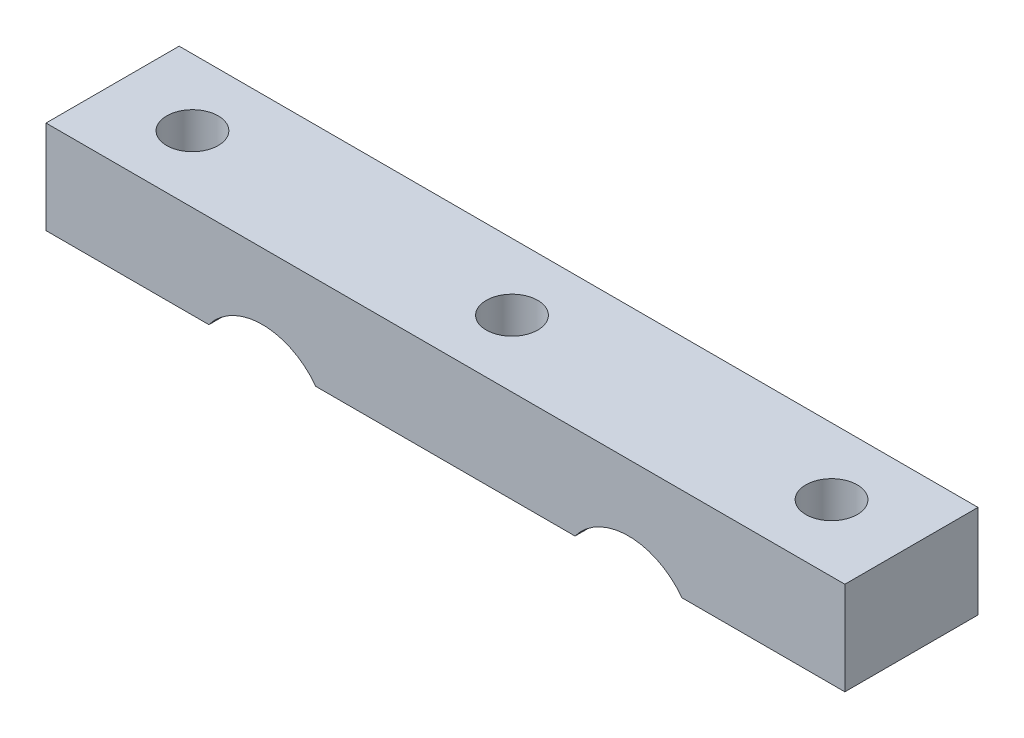
ISO-10303-21;
HEADER;
FILE_DESCRIPTION(('STEP AP214'),'2;1');
FILE_NAME('part.step','',(''),(''),'','','');
FILE_SCHEMA(('AUTOMOTIVE_DESIGN { 1 0 10303 214 1 1 1 1 }'));
ENDSEC;
DATA;
#1=APPLICATION_CONTEXT('core data for automotive mechanical design processes');
#2=APPLICATION_PROTOCOL_DEFINITION('international standard','automotive_design',2000,#1);
#3=PRODUCT_CONTEXT('',#1,'mechanical');
#4=PRODUCT('Part','Part','',(#3));
#5=PRODUCT_RELATED_PRODUCT_CATEGORY('part','',(#4));
#6=PRODUCT_DEFINITION_FORMATION('','',#4);
#7=PRODUCT_DEFINITION_CONTEXT('part definition',#1,'design');
#8=PRODUCT_DEFINITION('design','',#6,#7);
#9=PRODUCT_DEFINITION_SHAPE('','',#8);
#10=(LENGTH_UNIT() NAMED_UNIT(*) SI_UNIT(.MILLI.,.METRE.));
#11=(NAMED_UNIT(*) PLANE_ANGLE_UNIT() SI_UNIT($,.RADIAN.));
#12=(NAMED_UNIT(*) SI_UNIT($,.STERADIAN.) SOLID_ANGLE_UNIT());
#13=UNCERTAINTY_MEASURE_WITH_UNIT(LENGTH_MEASURE(1.E-05),#10,'distance_accuracy_value','');
#14=(GEOMETRIC_REPRESENTATION_CONTEXT(3) GLOBAL_UNCERTAINTY_ASSIGNED_CONTEXT((#13)) GLOBAL_UNIT_ASSIGNED_CONTEXT((#10,
#11,#12)) REPRESENTATION_CONTEXT('',''));
#15=CARTESIAN_POINT('',(0.,0.,0.));
#16=DIRECTION('',(0.,0.,1.));
#17=DIRECTION('',(1.,0.,0.));
#18=AXIS2_PLACEMENT_3D('',#15,#16,#17);
#19=CARTESIAN_POINT('',(-17.4625,20.9296,12.7));
#20=DIRECTION('',(0.,0.,-1.));
#21=DIRECTION('',(-1.,0.,0.));
#22=AXIS2_PLACEMENT_3D('',#19,#20,#21);
#23=CYLINDRICAL_SURFACE('',#22,6.35);
#24=CARTESIAN_POINT('',(-17.4625,20.9296,0.));
#25=DIRECTION('',(0.,0.,-1.));
#26=DIRECTION('',(1.,0.,0.));
#27=AXIS2_PLACEMENT_3D('',#24,#25,#26);
#28=CIRCLE('',#27,6.35);
#29=CARTESIAN_POINT('',(-22.5614511509721,24.7142,0.));
#30=VERTEX_POINT('',#29);
#31=CARTESIAN_POINT('',(-12.3635488490279,24.7142,0.));
#32=VERTEX_POINT('',#31);
#33=EDGE_CURVE('E139',#30,#32,#28,.T.);
#34=ORIENTED_EDGE('',*,*,#33,.T.);
#35=DIRECTION('',(0.,0.,-1.));
#36=VECTOR('',#35,1.);
#37=CARTESIAN_POINT('',(-12.3635488490279,24.7142,12.7));
#38=LINE('',#37,#36);
#39=CARTESIAN_POINT('',(-12.3635488490279,24.7142,12.7));
#40=VERTEX_POINT('',#39);
#41=EDGE_CURVE('E11',#40,#32,#38,.T.);
#42=ORIENTED_EDGE('',*,*,#41,.F.);
#43=CARTESIAN_POINT('',(-17.4625,20.9296,12.7));
#44=DIRECTION('',(0.,0.,-1.));
#45=DIRECTION('',(1.,0.,0.));
#46=AXIS2_PLACEMENT_3D('',#43,#44,#45);
#47=CIRCLE('',#46,6.35);
#48=CARTESIAN_POINT('',(-22.5614511509721,24.7142,12.7));
#49=VERTEX_POINT('',#48);
#50=EDGE_CURVE('E154',#49,#40,#47,.T.);
#51=ORIENTED_EDGE('',*,*,#50,.F.);
#52=DIRECTION('',(0.,0.,-1.));
#53=VECTOR('',#52,1.);
#54=CARTESIAN_POINT('',(-22.5614511509721,24.7142,12.7));
#55=LINE('',#54,#53);
#56=EDGE_CURVE('E135',#49,#30,#55,.T.);
#57=ORIENTED_EDGE('',*,*,#56,.T.);
#58=EDGE_LOOP('',(#34,#42,#51,#57));
#59=FACE_BOUND('',#58,.T.);
#60=ADVANCED_FACE('F43',(#59),#23,.F.);
#61=CARTESIAN_POINT('',(-12.3635488490279,24.7142,12.7));
#62=DIRECTION('',(0.,1.,0.));
#63=DIRECTION('',(0.,0.,1.));
#64=AXIS2_PLACEMENT_3D('',#61,#62,#63);
#65=PLANE('',#64);
#66=CARTESIAN_POINT('',(0.,24.7142,6.35));
#67=DIRECTION('',(0.,1.,0.));
#68=DIRECTION('',(0.,0.,1.));
#69=AXIS2_PLACEMENT_3D('',#66,#67,#68);
#70=CIRCLE('',#69,2.45745);
#71=CARTESIAN_POINT('',(0.,24.7142,8.80745));
#72=VERTEX_POINT('',#71);
#73=EDGE_CURVE('E192',#72,#72,#70,.T.);
#74=ORIENTED_EDGE('',*,*,#73,.T.);
#75=EDGE_LOOP('',(#74));
#76=FACE_BOUND('',#75,.T.);
#77=DIRECTION('',(1.,0.,0.));
#78=VECTOR('',#77,1.);
#79=CARTESIAN_POINT('',(-12.3635488490279,24.7142,0.));
#80=LINE('',#79,#78);
#81=CARTESIAN_POINT('',(12.3635488490279,24.7142,0.));
#82=VERTEX_POINT('',#81);
#83=EDGE_CURVE('E142',#32,#82,#80,.T.);
#84=ORIENTED_EDGE('',*,*,#83,.T.);
#85=DIRECTION('',(0.,0.,-1.));
#86=VECTOR('',#85,1.);
#87=CARTESIAN_POINT('',(12.3635488490279,24.7142,12.7));
#88=LINE('',#87,#86);
#89=CARTESIAN_POINT('',(12.3635488490279,24.7142,12.7));
#90=VERTEX_POINT('',#89);
#91=EDGE_CURVE('E51',#90,#82,#88,.T.);
#92=ORIENTED_EDGE('',*,*,#91,.F.);
#93=DIRECTION('',(1.,0.,0.));
#94=VECTOR('',#93,1.);
#95=CARTESIAN_POINT('',(-12.3635488490279,24.7142,12.7));
#96=LINE('',#95,#94);
#97=EDGE_CURVE('E102',#40,#90,#96,.T.);
#98=ORIENTED_EDGE('',*,*,#97,.F.);
#99=ORIENTED_EDGE('',*,*,#41,.T.);
#100=EDGE_LOOP('',(#84,#92,#98,#99));
#101=FACE_BOUND('',#100,.T.);
#102=ADVANCED_FACE('F230',(#76,#101),#65,.F.);
#103=CARTESIAN_POINT('',(17.4625,20.9296,12.7));
#104=DIRECTION('',(0.,0.,-1.));
#105=DIRECTION('',(-1.,0.,0.));
#106=AXIS2_PLACEMENT_3D('',#103,#104,#105);
#107=CYLINDRICAL_SURFACE('',#106,6.35);
#108=CARTESIAN_POINT('',(17.4625,20.9296,0.));
#109=DIRECTION('',(0.,0.,-1.));
#110=DIRECTION('',(-1.,0.,0.));
#111=AXIS2_PLACEMENT_3D('',#108,#109,#110);
#112=CIRCLE('',#111,6.35);
#113=CARTESIAN_POINT('',(22.5614511509721,24.7142,0.));
#114=VERTEX_POINT('',#113);
#115=EDGE_CURVE('E145',#82,#114,#112,.T.);
#116=ORIENTED_EDGE('',*,*,#115,.T.);
#117=DIRECTION('',(0.,0.,-1.));
#118=VECTOR('',#117,1.);
#119=CARTESIAN_POINT('',(22.5614511509721,24.7142,12.7));
#120=LINE('',#119,#118);
#121=CARTESIAN_POINT('',(22.5614511509721,24.7142,12.7));
#122=VERTEX_POINT('',#121);
#123=EDGE_CURVE('E161',#122,#114,#120,.T.);
#124=ORIENTED_EDGE('',*,*,#123,.F.);
#125=CARTESIAN_POINT('',(17.4625,20.9296,12.7));
#126=DIRECTION('',(0.,0.,-1.));
#127=DIRECTION('',(-1.,0.,0.));
#128=AXIS2_PLACEMENT_3D('',#125,#126,#127);
#129=CIRCLE('',#128,6.35);
#130=EDGE_CURVE('E169',#90,#122,#129,.T.);
#131=ORIENTED_EDGE('',*,*,#130,.F.);
#132=ORIENTED_EDGE('',*,*,#91,.T.);
#133=EDGE_LOOP('',(#116,#124,#131,#132));
#134=FACE_BOUND('',#133,.T.);
#135=ADVANCED_FACE('F167',(#134),#107,.F.);
#136=CARTESIAN_POINT('',(22.5614511509721,24.7142,12.7));
#137=DIRECTION('',(0.,1.,0.));
#138=DIRECTION('',(0.,0.,1.));
#139=AXIS2_PLACEMENT_3D('',#136,#137,#138);
#140=PLANE('',#139);
#141=CARTESIAN_POINT('',(30.48,24.7142,6.35));
#142=DIRECTION('',(0.,1.,0.));
#143=DIRECTION('',(0.,0.,1.));
#144=AXIS2_PLACEMENT_3D('',#141,#142,#143);
#145=CIRCLE('',#144,2.45745);
#146=CARTESIAN_POINT('',(30.48,24.7142,8.80745));
#147=VERTEX_POINT('',#146);
#148=EDGE_CURVE('E143',#147,#147,#145,.T.);
#149=ORIENTED_EDGE('',*,*,#148,.T.);
#150=EDGE_LOOP('',(#149));
#151=FACE_BOUND('',#150,.T.);
#152=DIRECTION('',(1.,0.,0.));
#153=VECTOR('',#152,1.);
#154=CARTESIAN_POINT('',(22.5614511509721,24.7142,0.));
#155=LINE('',#154,#153);
#156=CARTESIAN_POINT('',(38.1,24.7142,0.));
#157=VERTEX_POINT('',#156);
#158=EDGE_CURVE('E147',#114,#157,#155,.T.);
#159=ORIENTED_EDGE('',*,*,#158,.T.);
#160=DIRECTION('',(0.,0.,-1.));
#161=VECTOR('',#160,1.);
#162=CARTESIAN_POINT('',(38.1,24.7142,12.7));
#163=LINE('',#162,#161);
#164=CARTESIAN_POINT('',(38.1,24.7142,12.7));
#165=VERTEX_POINT('',#164);
#166=EDGE_CURVE('E158',#165,#157,#163,.T.);
#167=ORIENTED_EDGE('',*,*,#166,.F.);
#168=DIRECTION('',(1.,0.,0.));
#169=VECTOR('',#168,1.);
#170=CARTESIAN_POINT('',(22.5614511509721,24.7142,12.7));
#171=LINE('',#170,#169);
#172=EDGE_CURVE('E181',#122,#165,#171,.T.);
#173=ORIENTED_EDGE('',*,*,#172,.F.);
#174=ORIENTED_EDGE('',*,*,#123,.T.);
#175=EDGE_LOOP('',(#159,#167,#173,#174));
#176=FACE_BOUND('',#175,.T.);
#177=ADVANCED_FACE('F177',(#151,#176),#140,.F.);
#178=CARTESIAN_POINT('',(38.1,33.6042,12.7));
#179=DIRECTION('',(-1.,0.,0.));
#180=DIRECTION('',(0.,0.,1.));
#181=AXIS2_PLACEMENT_3D('',#178,#179,#180);
#182=PLANE('',#181);
#183=DIRECTION('',(0.,1.,0.));
#184=VECTOR('',#183,1.);
#185=CARTESIAN_POINT('',(38.1,33.6042,0.));
#186=LINE('',#185,#184);
#187=CARTESIAN_POINT('',(38.1,33.6042,0.));
#188=VERTEX_POINT('',#187);
#189=EDGE_CURVE('E149',#157,#188,#186,.T.);
#190=ORIENTED_EDGE('',*,*,#189,.T.);
#191=DIRECTION('',(0.,0.,-1.));
#192=VECTOR('',#191,1.);
#193=CARTESIAN_POINT('',(38.1,33.6042,12.7));
#194=LINE('',#193,#192);
#195=CARTESIAN_POINT('',(38.1,33.6042,12.7));
#196=VERTEX_POINT('',#195);
#197=EDGE_CURVE('E130',#196,#188,#194,.T.);
#198=ORIENTED_EDGE('',*,*,#197,.F.);
#199=DIRECTION('',(0.,1.,0.));
#200=VECTOR('',#199,1.);
#201=CARTESIAN_POINT('',(38.1,33.6042,12.7));
#202=LINE('',#201,#200);
#203=EDGE_CURVE('E121',#165,#196,#202,.T.);
#204=ORIENTED_EDGE('',*,*,#203,.F.);
#205=ORIENTED_EDGE('',*,*,#166,.T.);
#206=EDGE_LOOP('',(#190,#198,#204,#205));
#207=FACE_BOUND('',#206,.T.);
#208=ADVANCED_FACE('F180',(#207),#182,.F.);
#209=CARTESIAN_POINT('',(-38.1,33.6042,12.7));
#210=DIRECTION('',(0.,-1.,0.));
#211=DIRECTION('',(0.,0.,-1.));
#212=AXIS2_PLACEMENT_3D('',#209,#210,#211);
#213=PLANE('',#212);
#214=CARTESIAN_POINT('',(-30.48,33.6042,6.35000000000001));
#215=DIRECTION('',(0.,1.,0.));
#216=DIRECTION('',(0.,0.,1.));
#217=AXIS2_PLACEMENT_3D('',#214,#215,#216);
#218=CIRCLE('',#217,2.45745);
#219=CARTESIAN_POINT('',(-30.48,33.6042,8.80745));
#220=VERTEX_POINT('',#219);
#221=EDGE_CURVE('E201',#220,#220,#218,.T.);
#222=ORIENTED_EDGE('',*,*,#221,.F.);
#223=EDGE_LOOP('',(#222));
#224=FACE_BOUND('',#223,.T.);
#225=CARTESIAN_POINT('',(0.,33.6042,6.35));
#226=DIRECTION('',(0.,1.,0.));
#227=DIRECTION('',(0.,0.,1.));
#228=AXIS2_PLACEMENT_3D('',#225,#226,#227);
#229=CIRCLE('',#228,2.45745);
#230=CARTESIAN_POINT('',(0.,33.6042,8.80745));
#231=VERTEX_POINT('',#230);
#232=EDGE_CURVE('E195',#231,#231,#229,.T.);
#233=ORIENTED_EDGE('',*,*,#232,.F.);
#234=EDGE_LOOP('',(#233));
#235=FACE_BOUND('',#234,.T.);
#236=CARTESIAN_POINT('',(30.48,33.6042,6.35));
#237=DIRECTION('',(0.,1.,0.));
#238=DIRECTION('',(0.,0.,1.));
#239=AXIS2_PLACEMENT_3D('',#236,#237,#238);
#240=CIRCLE('',#239,2.45745);
#241=CARTESIAN_POINT('',(30.48,33.6042,8.80745));
#242=VERTEX_POINT('',#241);
#243=EDGE_CURVE('E189',#242,#242,#240,.T.);
#244=ORIENTED_EDGE('',*,*,#243,.F.);
#245=EDGE_LOOP('',(#244));
#246=FACE_BOUND('',#245,.T.);
#247=DIRECTION('',(-1.,0.,0.));
#248=VECTOR('',#247,1.);
#249=CARTESIAN_POINT('',(-38.1,33.6042,0.));
#250=LINE('',#249,#248);
#251=CARTESIAN_POINT('',(-38.1,33.6042,0.));
#252=VERTEX_POINT('',#251);
#253=EDGE_CURVE('E129',#188,#252,#250,.T.);
#254=ORIENTED_EDGE('',*,*,#253,.T.);
#255=DIRECTION('',(0.,0.,-1.));
#256=VECTOR('',#255,1.);
#257=CARTESIAN_POINT('',(-38.1,33.6042,12.7));
#258=LINE('',#257,#256);
#259=CARTESIAN_POINT('',(-38.1,33.6042,12.7));
#260=VERTEX_POINT('',#259);
#261=EDGE_CURVE('E126',#260,#252,#258,.T.);
#262=ORIENTED_EDGE('',*,*,#261,.F.);
#263=DIRECTION('',(-1.,0.,0.));
#264=VECTOR('',#263,1.);
#265=CARTESIAN_POINT('',(-38.1,33.6042,12.7));
#266=LINE('',#265,#264);
#267=EDGE_CURVE('E115',#196,#260,#266,.T.);
#268=ORIENTED_EDGE('',*,*,#267,.F.);
#269=ORIENTED_EDGE('',*,*,#197,.T.);
#270=EDGE_LOOP('',(#254,#262,#268,#269));
#271=FACE_BOUND('',#270,.T.);
#272=ADVANCED_FACE('F127',(#224,#235,#246,#271),#213,.F.);
#273=CARTESIAN_POINT('',(-38.1,24.7142,12.7));
#274=DIRECTION('',(1.,0.,0.));
#275=DIRECTION('',(0.,0.,-1.));
#276=AXIS2_PLACEMENT_3D('',#273,#274,#275);
#277=PLANE('',#276);
#278=DIRECTION('',(0.,-1.,0.));
#279=VECTOR('',#278,1.);
#280=CARTESIAN_POINT('',(-38.1,24.7142,0.));
#281=LINE('',#280,#279);
#282=CARTESIAN_POINT('',(-38.1,24.7142,0.));
#283=VERTEX_POINT('',#282);
#284=EDGE_CURVE('E88',#252,#283,#281,.T.);
#285=ORIENTED_EDGE('',*,*,#284,.T.);
#286=DIRECTION('',(0.,0.,-1.));
#287=VECTOR('',#286,1.);
#288=CARTESIAN_POINT('',(-38.1,24.7142,12.7));
#289=LINE('',#288,#287);
#290=CARTESIAN_POINT('',(-38.1,24.7142,12.7));
#291=VERTEX_POINT('',#290);
#292=EDGE_CURVE('E131',#291,#283,#289,.T.);
#293=ORIENTED_EDGE('',*,*,#292,.F.);
#294=DIRECTION('',(0.,-1.,0.));
#295=VECTOR('',#294,1.);
#296=CARTESIAN_POINT('',(-38.1,24.7142,12.7));
#297=LINE('',#296,#295);
#298=EDGE_CURVE('E119',#260,#291,#297,.T.);
#299=ORIENTED_EDGE('',*,*,#298,.F.);
#300=ORIENTED_EDGE('',*,*,#261,.T.);
#301=EDGE_LOOP('',(#285,#293,#299,#300));
#302=FACE_BOUND('',#301,.T.);
#303=ADVANCED_FACE('F133',(#302),#277,.F.);
#304=CARTESIAN_POINT('',(-38.1,24.7142,12.7));
#305=DIRECTION('',(0.,1.,0.));
#306=DIRECTION('',(0.,0.,1.));
#307=AXIS2_PLACEMENT_3D('',#304,#305,#306);
#308=PLANE('',#307);
#309=CARTESIAN_POINT('',(-30.48,24.7142,6.35000000000001));
#310=DIRECTION('',(0.,1.,0.));
#311=DIRECTION('',(0.,0.,1.));
#312=AXIS2_PLACEMENT_3D('',#309,#310,#311);
#313=CIRCLE('',#312,2.45745);
#314=CARTESIAN_POINT('',(-30.48,24.7142,8.80745));
#315=VERTEX_POINT('',#314);
#316=EDGE_CURVE('E198',#315,#315,#313,.T.);
#317=ORIENTED_EDGE('',*,*,#316,.T.);
#318=EDGE_LOOP('',(#317));
#319=FACE_BOUND('',#318,.T.);
#320=DIRECTION('',(1.,0.,0.));
#321=VECTOR('',#320,1.);
#322=CARTESIAN_POINT('',(-38.1,24.7142,0.));
#323=LINE('',#322,#321);
#324=EDGE_CURVE('E94',#283,#30,#323,.T.);
#325=ORIENTED_EDGE('',*,*,#324,.T.);
#326=ORIENTED_EDGE('',*,*,#56,.F.);
#327=DIRECTION('',(1.,0.,0.));
#328=VECTOR('',#327,1.);
#329=CARTESIAN_POINT('',(-38.1,24.7142,12.7));
#330=LINE('',#329,#328);
#331=EDGE_CURVE('E59',#291,#49,#330,.T.);
#332=ORIENTED_EDGE('',*,*,#331,.F.);
#333=ORIENTED_EDGE('',*,*,#292,.T.);
#334=EDGE_LOOP('',(#325,#326,#332,#333));
#335=FACE_BOUND('',#334,.T.);
#336=ADVANCED_FACE('F239',(#319,#335),#308,.F.);
#337=CARTESIAN_POINT('',(-17.4625,20.9296,12.7));
#338=DIRECTION('',(0.,0.,1.));
#339=DIRECTION('',(1.,0.,0.));
#340=AXIS2_PLACEMENT_3D('',#337,#338,#339);
#341=PLANE('',#340);
#342=ORIENTED_EDGE('',*,*,#50,.T.);
#343=ORIENTED_EDGE('',*,*,#97,.T.);
#344=ORIENTED_EDGE('',*,*,#130,.T.);
#345=ORIENTED_EDGE('',*,*,#172,.T.);
#346=ORIENTED_EDGE('',*,*,#203,.T.);
#347=ORIENTED_EDGE('',*,*,#267,.T.);
#348=ORIENTED_EDGE('',*,*,#298,.T.);
#349=ORIENTED_EDGE('',*,*,#331,.T.);
#350=EDGE_LOOP('',(#342,#343,#344,#345,#346,#347,#348,#349));
#351=FACE_BOUND('',#350,.T.);
#352=ADVANCED_FACE('F117',(#351),#341,.T.);
#353=CARTESIAN_POINT('',(-17.4625,20.9296,0.));
#354=DIRECTION('',(0.,0.,1.));
#355=DIRECTION('',(1.,0.,0.));
#356=AXIS2_PLACEMENT_3D('',#353,#354,#355);
#357=PLANE('',#356);
#358=ORIENTED_EDGE('',*,*,#33,.F.);
#359=ORIENTED_EDGE('',*,*,#324,.F.);
#360=ORIENTED_EDGE('',*,*,#284,.F.);
#361=ORIENTED_EDGE('',*,*,#253,.F.);
#362=ORIENTED_EDGE('',*,*,#189,.F.);
#363=ORIENTED_EDGE('',*,*,#158,.F.);
#364=ORIENTED_EDGE('',*,*,#115,.F.);
#365=ORIENTED_EDGE('',*,*,#83,.F.);
#366=EDGE_LOOP('',(#358,#359,#360,#361,#362,#363,#364,#365));
#367=FACE_BOUND('',#366,.T.);
#368=ADVANCED_FACE('F173',(#367),#357,.F.);
#369=CARTESIAN_POINT('',(30.48,33.6042,6.35));
#370=DIRECTION('',(0.,1.,0.));
#371=DIRECTION('',(0.,0.,1.));
#372=AXIS2_PLACEMENT_3D('',#369,#370,#371);
#373=CYLINDRICAL_SURFACE('',#372,2.45745);
#374=ORIENTED_EDGE('',*,*,#148,.F.);
#375=EDGE_LOOP('',(#374));
#376=FACE_BOUND('',#375,.T.);
#377=ORIENTED_EDGE('',*,*,#243,.T.);
#378=EDGE_LOOP('',(#377));
#379=FACE_BOUND('',#378,.T.);
#380=ADVANCED_FACE('F214',(#376,#379),#373,.F.);
#381=CARTESIAN_POINT('',(0.,33.6042,6.35));
#382=DIRECTION('',(0.,1.,0.));
#383=DIRECTION('',(0.,0.,1.));
#384=AXIS2_PLACEMENT_3D('',#381,#382,#383);
#385=CYLINDRICAL_SURFACE('',#384,2.45745);
#386=ORIENTED_EDGE('',*,*,#73,.F.);
#387=EDGE_LOOP('',(#386));
#388=FACE_BOUND('',#387,.T.);
#389=ORIENTED_EDGE('',*,*,#232,.T.);
#390=EDGE_LOOP('',(#389));
#391=FACE_BOUND('',#390,.T.);
#392=ADVANCED_FACE('F216',(#388,#391),#385,.F.);
#393=CARTESIAN_POINT('',(-30.48,33.6042,6.35000000000001));
#394=DIRECTION('',(0.,1.,0.));
#395=DIRECTION('',(0.,0.,1.));
#396=AXIS2_PLACEMENT_3D('',#393,#394,#395);
#397=CYLINDRICAL_SURFACE('',#396,2.45745);
#398=ORIENTED_EDGE('',*,*,#316,.F.);
#399=EDGE_LOOP('',(#398));
#400=FACE_BOUND('',#399,.T.);
#401=ORIENTED_EDGE('',*,*,#221,.T.);
#402=EDGE_LOOP('',(#401));
#403=FACE_BOUND('',#402,.T.);
#404=ADVANCED_FACE('F205',(#400,#403),#397,.F.);
#405=CLOSED_SHELL('',(#60,#102,#135,#177,#208,#272,#303,#336,#352,#368,#380,#392,#404));
#406=MANIFOLD_SOLID_BREP('B2',#405);
#407=ADVANCED_BREP_SHAPE_REPRESENTATION('',(#18,#406),#14);
#408=SHAPE_DEFINITION_REPRESENTATION(#9,#407);
ENDSEC;
END-ISO-10303-21;
